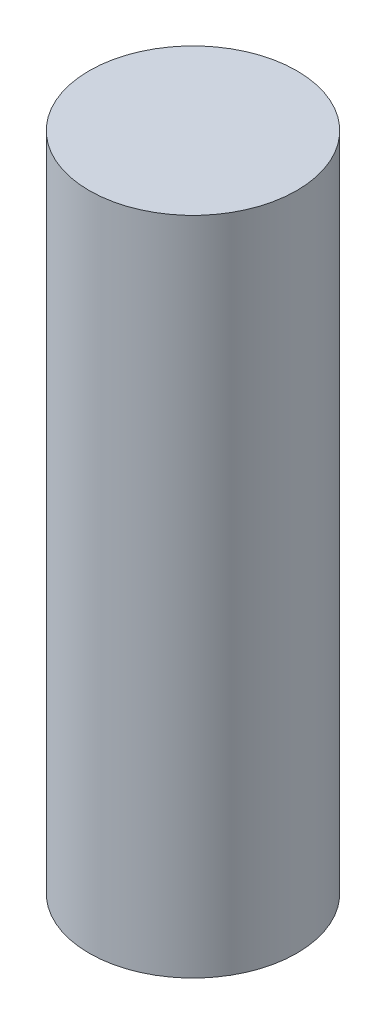
ISO-10303-21;
HEADER;
FILE_DESCRIPTION(('STEP AP214'),'2;1');
FILE_NAME('part.step','',(''),(''),'','','');
FILE_SCHEMA(('AUTOMOTIVE_DESIGN { 1 0 10303 214 1 1 1 1 }'));
ENDSEC;
DATA;
#1=APPLICATION_CONTEXT('core data for automotive mechanical design processes');
#2=APPLICATION_PROTOCOL_DEFINITION('international standard','automotive_design',2000,#1);
#3=PRODUCT_CONTEXT('',#1,'mechanical');
#4=PRODUCT('Part','Part','',(#3));
#5=PRODUCT_RELATED_PRODUCT_CATEGORY('part','',(#4));
#6=PRODUCT_DEFINITION_FORMATION('','',#4);
#7=PRODUCT_DEFINITION_CONTEXT('part definition',#1,'design');
#8=PRODUCT_DEFINITION('design','',#6,#7);
#9=PRODUCT_DEFINITION_SHAPE('','',#8);
#10=(LENGTH_UNIT() NAMED_UNIT(*) SI_UNIT(.MILLI.,.METRE.));
#11=(NAMED_UNIT(*) PLANE_ANGLE_UNIT() SI_UNIT($,.RADIAN.));
#12=(NAMED_UNIT(*) SI_UNIT($,.STERADIAN.) SOLID_ANGLE_UNIT());
#13=UNCERTAINTY_MEASURE_WITH_UNIT(LENGTH_MEASURE(1.E-05),#10,'distance_accuracy_value','');
#14=(GEOMETRIC_REPRESENTATION_CONTEXT(3) GLOBAL_UNCERTAINTY_ASSIGNED_CONTEXT((#13)) GLOBAL_UNIT_ASSIGNED_CONTEXT((#10,
#11,#12)) REPRESENTATION_CONTEXT('',''));
#15=CARTESIAN_POINT('',(0.,0.,0.));
#16=DIRECTION('',(0.,0.,1.));
#17=DIRECTION('',(1.,0.,0.));
#18=AXIS2_PLACEMENT_3D('',#15,#16,#17);
#19=CARTESIAN_POINT('',(0.,175.,0.));
#20=DIRECTION('',(0.,-1.,0.));
#21=DIRECTION('',(0.,0.,-1.));
#22=AXIS2_PLACEMENT_3D('',#19,#20,#21);
#23=CYLINDRICAL_SURFACE('',#22,27.5);
#24=CARTESIAN_POINT('',(0.,175.,0.));
#25=DIRECTION('',(0.,1.,0.));
#26=DIRECTION('',(0.,0.,1.));
#27=AXIS2_PLACEMENT_3D('',#24,#25,#26);
#28=CIRCLE('',#27,27.5);
#29=CARTESIAN_POINT('',(0.,175.,27.5));
#30=VERTEX_POINT('',#29);
#31=EDGE_CURVE('E10',#30,#30,#28,.T.);
#32=ORIENTED_EDGE('',*,*,#31,.F.);
#33=EDGE_LOOP('',(#32));
#34=FACE_BOUND('',#33,.T.);
#35=CARTESIAN_POINT('',(0.,0.,0.));
#36=DIRECTION('',(0.,1.,0.));
#37=DIRECTION('',(0.,0.,1.));
#38=AXIS2_PLACEMENT_3D('',#35,#36,#37);
#39=CIRCLE('',#38,27.5);
#40=CARTESIAN_POINT('',(0.,0.,27.5));
#41=VERTEX_POINT('',#40);
#42=EDGE_CURVE('E40',#41,#41,#39,.T.);
#43=ORIENTED_EDGE('',*,*,#42,.T.);
#44=EDGE_LOOP('',(#43));
#45=FACE_BOUND('',#44,.T.);
#46=ADVANCED_FACE('F37',(#34,#45),#23,.T.);
#47=CARTESIAN_POINT('',(0.,175.,0.));
#48=DIRECTION('',(0.,1.,0.));
#49=DIRECTION('',(0.,0.,1.));
#50=AXIS2_PLACEMENT_3D('',#47,#48,#49);
#51=PLANE('',#50);
#52=ORIENTED_EDGE('',*,*,#31,.T.);
#53=EDGE_LOOP('',(#52));
#54=FACE_BOUND('',#53,.T.);
#55=ADVANCED_FACE('F54',(#54),#51,.T.);
#56=CARTESIAN_POINT('',(0.,0.,0.));
#57=DIRECTION('',(0.,1.,0.));
#58=DIRECTION('',(0.,0.,1.));
#59=AXIS2_PLACEMENT_3D('',#56,#57,#58);
#60=PLANE('',#59);
#61=ORIENTED_EDGE('',*,*,#42,.F.);
#62=EDGE_LOOP('',(#61));
#63=FACE_BOUND('',#62,.T.);
#64=ADVANCED_FACE('F52',(#63),#60,.F.);
#65=CLOSED_SHELL('',(#46,#55,#64));
#66=MANIFOLD_SOLID_BREP('B2',#65);
#67=ADVANCED_BREP_SHAPE_REPRESENTATION('',(#18,#66),#14);
#68=SHAPE_DEFINITION_REPRESENTATION(#9,#67);
ENDSEC;
END-ISO-10303-21;
